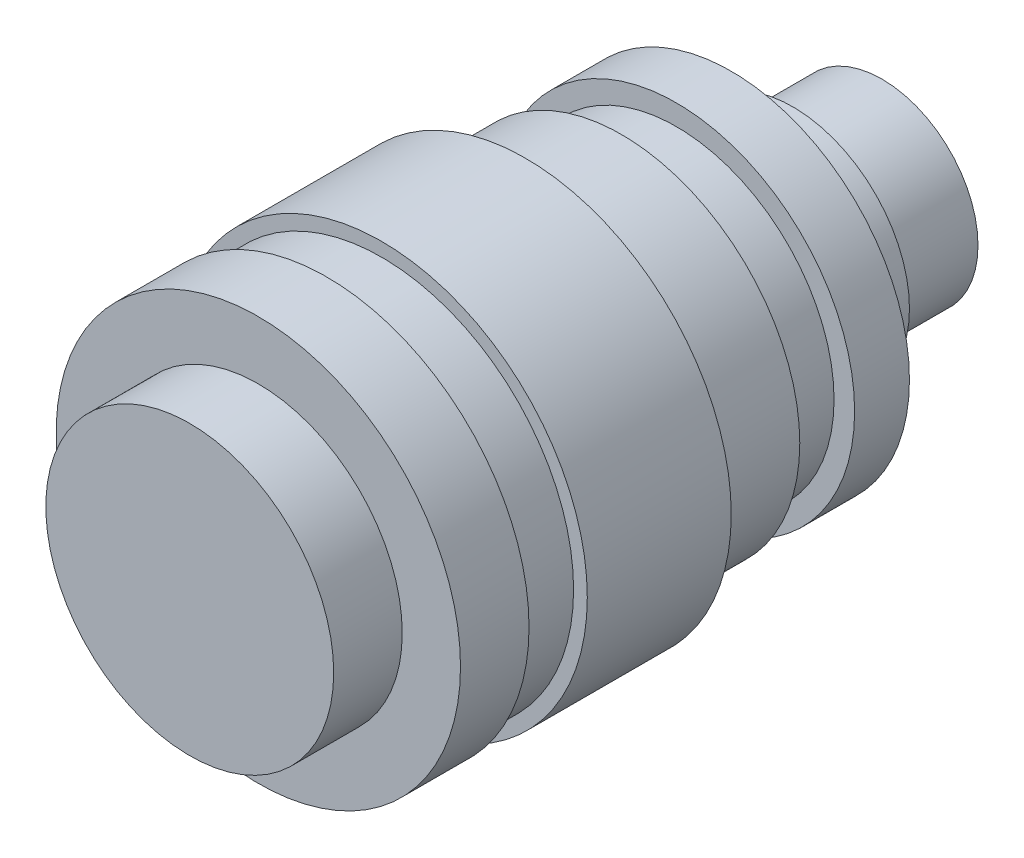
ISO-10303-21;
HEADER;
FILE_DESCRIPTION(('STEP AP214'),'2;1');
FILE_NAME('part.step','',(''),(''),'','','');
FILE_SCHEMA(('AUTOMOTIVE_DESIGN { 1 0 10303 214 1 1 1 1 }'));
ENDSEC;
DATA;
#1=APPLICATION_CONTEXT('core data for automotive mechanical design processes');
#2=APPLICATION_PROTOCOL_DEFINITION('international standard','automotive_design',2000,#1);
#3=PRODUCT_CONTEXT('',#1,'mechanical');
#4=PRODUCT('Part','Part','',(#3));
#5=PRODUCT_RELATED_PRODUCT_CATEGORY('part','',(#4));
#6=PRODUCT_DEFINITION_FORMATION('','',#4);
#7=PRODUCT_DEFINITION_CONTEXT('part definition',#1,'design');
#8=PRODUCT_DEFINITION('design','',#6,#7);
#9=PRODUCT_DEFINITION_SHAPE('','',#8);
#10=(LENGTH_UNIT() NAMED_UNIT(*) SI_UNIT(.MILLI.,.METRE.));
#11=(NAMED_UNIT(*) PLANE_ANGLE_UNIT() SI_UNIT($,.RADIAN.));
#12=(NAMED_UNIT(*) SI_UNIT($,.STERADIAN.) SOLID_ANGLE_UNIT());
#13=UNCERTAINTY_MEASURE_WITH_UNIT(LENGTH_MEASURE(1.E-05),#10,'distance_accuracy_value','');
#14=(GEOMETRIC_REPRESENTATION_CONTEXT(3) GLOBAL_UNCERTAINTY_ASSIGNED_CONTEXT((#13)) GLOBAL_UNIT_ASSIGNED_CONTEXT((#10,
#11,#12)) REPRESENTATION_CONTEXT('',''));
#15=CARTESIAN_POINT('',(0.,0.,0.));
#16=DIRECTION('',(0.,0.,1.));
#17=DIRECTION('',(1.,0.,0.));
#18=AXIS2_PLACEMENT_3D('',#15,#16,#17);
#19=CARTESIAN_POINT('',(0.,0.,5.));
#20=DIRECTION('',(0.,0.,1.));
#21=DIRECTION('',(1.,0.,0.));
#22=AXIS2_PLACEMENT_3D('',#19,#20,#21);
#23=PLANE('',#22);
#24=CARTESIAN_POINT('',(0.,0.,5.));
#25=DIRECTION('',(0.,0.,1.));
#26=DIRECTION('',(1.,0.,0.));
#27=AXIS2_PLACEMENT_3D('',#24,#25,#26);
#28=CIRCLE('',#27,10.5);
#29=CARTESIAN_POINT('',(10.5,0.,5.));
#30=VERTEX_POINT('',#29);
#31=EDGE_CURVE('E90',#30,#30,#28,.T.);
#32=ORIENTED_EDGE('',*,*,#31,.T.);
#33=EDGE_LOOP('',(#32));
#34=FACE_BOUND('',#33,.T.);
#35=ADVANCED_FACE('F32',(#34),#23,.T.);
#36=CARTESIAN_POINT('',(0.,0.,-45.4999999999999));
#37=DIRECTION('',(0.,0.,1.));
#38=DIRECTION('',(1.,0.,0.));
#39=AXIS2_PLACEMENT_3D('',#36,#37,#38);
#40=PLANE('',#39);
#41=CARTESIAN_POINT('',(0.,0.,-45.4999999999999));
#42=DIRECTION('',(0.,0.,1.));
#43=DIRECTION('',(1.,0.,0.));
#44=AXIS2_PLACEMENT_3D('',#41,#42,#43);
#45=CIRCLE('',#44,7.);
#46=CARTESIAN_POINT('',(7.,0.,-45.4999999999999));
#47=VERTEX_POINT('',#46);
#48=EDGE_CURVE('E10',#47,#47,#45,.T.);
#49=ORIENTED_EDGE('',*,*,#48,.F.);
#50=EDGE_LOOP('',(#49));
#51=FACE_BOUND('',#50,.T.);
#52=ADVANCED_FACE('F113',(#51),#40,.F.);
#53=CARTESIAN_POINT('',(0.,0.,-9.));
#54=DIRECTION('',(0.,0.,1.));
#55=DIRECTION('',(1.,0.,0.));
#56=AXIS2_PLACEMENT_3D('',#53,#54,#55);
#57=CYLINDRICAL_SURFACE('',#56,7.);
#58=ORIENTED_EDGE('',*,*,#48,.T.);
#59=EDGE_LOOP('',(#58));
#60=FACE_BOUND('',#59,.T.);
#61=CARTESIAN_POINT('',(0.,0.,-39.));
#62=DIRECTION('',(0.,0.,1.));
#63=DIRECTION('',(1.,0.,0.));
#64=AXIS2_PLACEMENT_3D('',#61,#62,#63);
#65=CIRCLE('',#64,7.);
#66=CARTESIAN_POINT('',(7.,0.,-39.));
#67=VERTEX_POINT('',#66);
#68=EDGE_CURVE('E38',#67,#67,#65,.T.);
#69=ORIENTED_EDGE('',*,*,#68,.F.);
#70=EDGE_LOOP('',(#69));
#71=FACE_BOUND('',#70,.T.);
#72=ADVANCED_FACE('F117',(#60,#71),#57,.T.);
#73=CARTESIAN_POINT('',(0.,-4.45721890768628E-13,-39.));
#74=DIRECTION('',(0.,0.,1.));
#75=DIRECTION('',(1.,0.,0.));
#76=AXIS2_PLACEMENT_3D('',#73,#74,#75);
#77=PLANE('',#76);
#78=CARTESIAN_POINT('',(0.,0.,-39.));
#79=DIRECTION('',(0.,0.,1.));
#80=DIRECTION('',(1.,0.,0.));
#81=AXIS2_PLACEMENT_3D('',#78,#79,#80);
#82=CIRCLE('',#81,8.5);
#83=CARTESIAN_POINT('',(8.5,0.,-39.));
#84=VERTEX_POINT('',#83);
#85=EDGE_CURVE('E42',#84,#84,#82,.T.);
#86=ORIENTED_EDGE('',*,*,#85,.F.);
#87=EDGE_LOOP('',(#86));
#88=FACE_BOUND('',#87,.T.);
#89=ORIENTED_EDGE('',*,*,#68,.T.);
#90=EDGE_LOOP('',(#89));
#91=FACE_BOUND('',#90,.T.);
#92=ADVANCED_FACE('F122',(#88,#91),#77,.F.);
#93=CARTESIAN_POINT('',(0.,0.,-9.));
#94=DIRECTION('',(0.,0.,1.));
#95=DIRECTION('',(1.,0.,0.));
#96=AXIS2_PLACEMENT_3D('',#93,#94,#95);
#97=CYLINDRICAL_SURFACE('',#96,8.5);
#98=ORIENTED_EDGE('',*,*,#85,.T.);
#99=EDGE_LOOP('',(#98));
#100=FACE_BOUND('',#99,.T.);
#101=CARTESIAN_POINT('',(0.,0.,-34.4999999999999));
#102=DIRECTION('',(0.,0.,1.));
#103=DIRECTION('',(1.,0.,0.));
#104=AXIS2_PLACEMENT_3D('',#101,#102,#103);
#105=CIRCLE('',#104,8.5);
#106=CARTESIAN_POINT('',(8.5,0.,-34.4999999999999));
#107=VERTEX_POINT('',#106);
#108=EDGE_CURVE('E46',#107,#107,#105,.T.);
#109=ORIENTED_EDGE('',*,*,#108,.F.);
#110=EDGE_LOOP('',(#109));
#111=FACE_BOUND('',#110,.T.);
#112=ADVANCED_FACE('F127',(#100,#111),#97,.T.);
#113=CARTESIAN_POINT('',(0.,2.5780659658363E-13,-34.4999999999999));
#114=DIRECTION('',(0.,0.,1.));
#115=DIRECTION('',(1.,0.,0.));
#116=AXIS2_PLACEMENT_3D('',#113,#114,#115);
#117=PLANE('',#116);
#118=CARTESIAN_POINT('',(0.,0.,-34.4999999999999));
#119=DIRECTION('',(0.,0.,1.));
#120=DIRECTION('',(1.,0.,0.));
#121=AXIS2_PLACEMENT_3D('',#118,#119,#120);
#122=CIRCLE('',#121,13.);
#123=CARTESIAN_POINT('',(13.,0.,-34.4999999999999));
#124=VERTEX_POINT('',#123);
#125=EDGE_CURVE('E51',#124,#124,#122,.T.);
#126=ORIENTED_EDGE('',*,*,#125,.F.);
#127=EDGE_LOOP('',(#126));
#128=FACE_BOUND('',#127,.T.);
#129=ORIENTED_EDGE('',*,*,#108,.T.);
#130=EDGE_LOOP('',(#129));
#131=FACE_BOUND('',#130,.T.);
#132=ADVANCED_FACE('F131',(#128,#131),#117,.F.);
#133=CARTESIAN_POINT('',(0.,0.,-9.));
#134=DIRECTION('',(0.,0.,1.));
#135=DIRECTION('',(1.,0.,0.));
#136=AXIS2_PLACEMENT_3D('',#133,#134,#135);
#137=CYLINDRICAL_SURFACE('',#136,13.);
#138=ORIENTED_EDGE('',*,*,#125,.T.);
#139=EDGE_LOOP('',(#138));
#140=FACE_BOUND('',#139,.T.);
#141=CARTESIAN_POINT('',(0.,0.,-30.4999999999999));
#142=DIRECTION('',(0.,0.,1.));
#143=DIRECTION('',(1.,0.,0.));
#144=AXIS2_PLACEMENT_3D('',#141,#142,#143);
#145=CIRCLE('',#144,13.);
#146=CARTESIAN_POINT('',(13.,0.,-30.4999999999999));
#147=VERTEX_POINT('',#146);
#148=EDGE_CURVE('E54',#147,#147,#145,.T.);
#149=ORIENTED_EDGE('',*,*,#148,.F.);
#150=EDGE_LOOP('',(#149));
#151=FACE_BOUND('',#150,.T.);
#152=ADVANCED_FACE('F135',(#140,#151),#137,.T.);
#153=CARTESIAN_POINT('',(0.,0.,-30.4999999999999));
#154=DIRECTION('',(0.,0.,1.));
#155=DIRECTION('',(1.,0.,0.));
#156=AXIS2_PLACEMENT_3D('',#153,#154,#155);
#157=PLANE('',#156);
#158=ORIENTED_EDGE('',*,*,#148,.T.);
#159=EDGE_LOOP('',(#158));
#160=FACE_BOUND('',#159,.T.);
#161=CARTESIAN_POINT('',(0.,0.,-30.5));
#162=DIRECTION('',(0.,0.,1.));
#163=DIRECTION('',(1.,0.,0.));
#164=AXIS2_PLACEMENT_3D('',#161,#162,#163);
#165=CIRCLE('',#164,11.5);
#166=CARTESIAN_POINT('',(11.5,0.,-30.5));
#167=VERTEX_POINT('',#166);
#168=EDGE_CURVE('E57',#167,#167,#165,.T.);
#169=ORIENTED_EDGE('',*,*,#168,.F.);
#170=EDGE_LOOP('',(#169));
#171=FACE_BOUND('',#170,.T.);
#172=ADVANCED_FACE('F139',(#160,#171),#157,.T.);
#173=CARTESIAN_POINT('',(0.,0.,-9.));
#174=DIRECTION('',(0.,0.,1.));
#175=DIRECTION('',(1.,0.,0.));
#176=AXIS2_PLACEMENT_3D('',#173,#174,#175);
#177=CYLINDRICAL_SURFACE('',#176,11.5);
#178=ORIENTED_EDGE('',*,*,#168,.T.);
#179=EDGE_LOOP('',(#178));
#180=FACE_BOUND('',#179,.T.);
#181=CARTESIAN_POINT('',(0.,0.,-26.5));
#182=DIRECTION('',(0.,0.,1.));
#183=DIRECTION('',(1.,0.,0.));
#184=AXIS2_PLACEMENT_3D('',#181,#182,#183);
#185=CIRCLE('',#184,11.5);
#186=CARTESIAN_POINT('',(11.5,0.,-26.5));
#187=VERTEX_POINT('',#186);
#188=EDGE_CURVE('E60',#187,#187,#185,.T.);
#189=ORIENTED_EDGE('',*,*,#188,.F.);
#190=EDGE_LOOP('',(#189));
#191=FACE_BOUND('',#190,.T.);
#192=ADVANCED_FACE('F143',(#180,#191),#177,.T.);
#193=CARTESIAN_POINT('',(0.,0.,-26.5));
#194=DIRECTION('',(0.,0.,1.));
#195=DIRECTION('',(1.,0.,0.));
#196=AXIS2_PLACEMENT_3D('',#193,#194,#195);
#197=PLANE('',#196);
#198=CARTESIAN_POINT('',(0.,0.,-26.5));
#199=DIRECTION('',(0.,0.,1.));
#200=DIRECTION('',(1.,0.,0.));
#201=AXIS2_PLACEMENT_3D('',#198,#199,#200);
#202=CIRCLE('',#201,13.);
#203=CARTESIAN_POINT('',(13.,0.,-26.5));
#204=VERTEX_POINT('',#203);
#205=EDGE_CURVE('E63',#204,#204,#202,.T.);
#206=ORIENTED_EDGE('',*,*,#205,.F.);
#207=EDGE_LOOP('',(#206));
#208=FACE_BOUND('',#207,.T.);
#209=ORIENTED_EDGE('',*,*,#188,.T.);
#210=EDGE_LOOP('',(#209));
#211=FACE_BOUND('',#210,.T.);
#212=ADVANCED_FACE('F147',(#208,#211),#197,.F.);
#213=CARTESIAN_POINT('',(0.,0.,-9.));
#214=DIRECTION('',(0.,0.,1.));
#215=DIRECTION('',(1.,0.,0.));
#216=AXIS2_PLACEMENT_3D('',#213,#214,#215);
#217=CYLINDRICAL_SURFACE('',#216,13.);
#218=ORIENTED_EDGE('',*,*,#205,.T.);
#219=EDGE_LOOP('',(#218));
#220=FACE_BOUND('',#219,.T.);
#221=CARTESIAN_POINT('',(0.,0.,-19.5));
#222=DIRECTION('',(0.,0.,1.));
#223=DIRECTION('',(1.,0.,0.));
#224=AXIS2_PLACEMENT_3D('',#221,#222,#223);
#225=CIRCLE('',#224,13.);
#226=CARTESIAN_POINT('',(13.,0.,-19.5));
#227=VERTEX_POINT('',#226);
#228=EDGE_CURVE('E66',#227,#227,#225,.T.);
#229=ORIENTED_EDGE('',*,*,#228,.F.);
#230=EDGE_LOOP('',(#229));
#231=FACE_BOUND('',#230,.T.);
#232=ADVANCED_FACE('F151',(#220,#231),#217,.T.);
#233=CARTESIAN_POINT('',(0.,0.,-19.5));
#234=DIRECTION('',(0.,0.,1.));
#235=DIRECTION('',(1.,0.,0.));
#236=AXIS2_PLACEMENT_3D('',#233,#234,#235);
#237=PLANE('',#236);
#238=CARTESIAN_POINT('',(0.,0.,-19.5));
#239=DIRECTION('',(0.,0.,1.));
#240=DIRECTION('',(1.,0.,0.));
#241=AXIS2_PLACEMENT_3D('',#238,#239,#240);
#242=CIRCLE('',#241,15.);
#243=CARTESIAN_POINT('',(15.,0.,-19.5));
#244=VERTEX_POINT('',#243);
#245=EDGE_CURVE('E69',#244,#244,#242,.T.);
#246=ORIENTED_EDGE('',*,*,#245,.F.);
#247=EDGE_LOOP('',(#246));
#248=FACE_BOUND('',#247,.T.);
#249=ORIENTED_EDGE('',*,*,#228,.T.);
#250=EDGE_LOOP('',(#249));
#251=FACE_BOUND('',#250,.T.);
#252=ADVANCED_FACE('F155',(#248,#251),#237,.F.);
#253=CARTESIAN_POINT('',(0.,0.,-9.));
#254=DIRECTION('',(0.,0.,1.));
#255=DIRECTION('',(1.,0.,0.));
#256=AXIS2_PLACEMENT_3D('',#253,#254,#255);
#257=CYLINDRICAL_SURFACE('',#256,15.);
#258=ORIENTED_EDGE('',*,*,#245,.T.);
#259=EDGE_LOOP('',(#258));
#260=FACE_BOUND('',#259,.T.);
#261=CARTESIAN_POINT('',(0.,0.,-9.));
#262=DIRECTION('',(0.,0.,1.));
#263=DIRECTION('',(1.,0.,0.));
#264=AXIS2_PLACEMENT_3D('',#261,#262,#263);
#265=CIRCLE('',#264,15.);
#266=CARTESIAN_POINT('',(15.,0.,-9.));
#267=VERTEX_POINT('',#266);
#268=EDGE_CURVE('E72',#267,#267,#265,.T.);
#269=ORIENTED_EDGE('',*,*,#268,.F.);
#270=EDGE_LOOP('',(#269));
#271=FACE_BOUND('',#270,.T.);
#272=ADVANCED_FACE('F159',(#260,#271),#257,.T.);
#273=CARTESIAN_POINT('',(0.,0.,-9.));
#274=DIRECTION('',(0.,0.,1.));
#275=DIRECTION('',(1.,0.,0.));
#276=AXIS2_PLACEMENT_3D('',#273,#274,#275);
#277=PLANE('',#276);
#278=ORIENTED_EDGE('',*,*,#268,.T.);
#279=EDGE_LOOP('',(#278));
#280=FACE_BOUND('',#279,.T.);
#281=CARTESIAN_POINT('',(0.,0.,-9.));
#282=DIRECTION('',(0.,0.,1.));
#283=DIRECTION('',(1.,0.,0.));
#284=AXIS2_PLACEMENT_3D('',#281,#282,#283);
#285=CIRCLE('',#284,14.);
#286=CARTESIAN_POINT('',(14.,0.,-9.));
#287=VERTEX_POINT('',#286);
#288=EDGE_CURVE('E75',#287,#287,#285,.T.);
#289=ORIENTED_EDGE('',*,*,#288,.F.);
#290=EDGE_LOOP('',(#289));
#291=FACE_BOUND('',#290,.T.);
#292=ADVANCED_FACE('F163',(#280,#291),#277,.T.);
#293=CARTESIAN_POINT('',(0.,0.,-9.));
#294=DIRECTION('',(0.,0.,1.));
#295=DIRECTION('',(1.,0.,0.));
#296=AXIS2_PLACEMENT_3D('',#293,#294,#295);
#297=CYLINDRICAL_SURFACE('',#296,14.);
#298=ORIENTED_EDGE('',*,*,#288,.T.);
#299=EDGE_LOOP('',(#298));
#300=FACE_BOUND('',#299,.T.);
#301=CARTESIAN_POINT('',(0.,0.,-5.));
#302=DIRECTION('',(0.,0.,1.));
#303=DIRECTION('',(1.,0.,0.));
#304=AXIS2_PLACEMENT_3D('',#301,#302,#303);
#305=CIRCLE('',#304,14.);
#306=CARTESIAN_POINT('',(14.,0.,-5.));
#307=VERTEX_POINT('',#306);
#308=EDGE_CURVE('E78',#307,#307,#305,.T.);
#309=ORIENTED_EDGE('',*,*,#308,.F.);
#310=EDGE_LOOP('',(#309));
#311=FACE_BOUND('',#310,.T.);
#312=ADVANCED_FACE('F167',(#300,#311),#297,.T.);
#313=CARTESIAN_POINT('',(0.,0.,-5.));
#314=DIRECTION('',(0.,0.,1.));
#315=DIRECTION('',(1.,0.,0.));
#316=AXIS2_PLACEMENT_3D('',#313,#314,#315);
#317=PLANE('',#316);
#318=CARTESIAN_POINT('',(0.,0.,-5.));
#319=DIRECTION('',(0.,0.,1.));
#320=DIRECTION('',(1.,0.,0.));
#321=AXIS2_PLACEMENT_3D('',#318,#319,#320);
#322=CIRCLE('',#321,14.75);
#323=CARTESIAN_POINT('',(14.75,0.,-5.));
#324=VERTEX_POINT('',#323);
#325=EDGE_CURVE('E81',#324,#324,#322,.T.);
#326=ORIENTED_EDGE('',*,*,#325,.F.);
#327=EDGE_LOOP('',(#326));
#328=FACE_BOUND('',#327,.T.);
#329=ORIENTED_EDGE('',*,*,#308,.T.);
#330=EDGE_LOOP('',(#329));
#331=FACE_BOUND('',#330,.T.);
#332=ADVANCED_FACE('F109',(#328,#331),#317,.F.);
#333=CARTESIAN_POINT('',(0.,0.,-9.));
#334=DIRECTION('',(0.,0.,1.));
#335=DIRECTION('',(1.,0.,0.));
#336=AXIS2_PLACEMENT_3D('',#333,#334,#335);
#337=CYLINDRICAL_SURFACE('',#336,14.75);
#338=ORIENTED_EDGE('',*,*,#325,.T.);
#339=EDGE_LOOP('',(#338));
#340=FACE_BOUND('',#339,.T.);
#341=CARTESIAN_POINT('',(0.,0.,0.));
#342=DIRECTION('',(0.,0.,1.));
#343=DIRECTION('',(1.,0.,0.));
#344=AXIS2_PLACEMENT_3D('',#341,#342,#343);
#345=CIRCLE('',#344,14.75);
#346=CARTESIAN_POINT('',(14.75,0.,0.));
#347=VERTEX_POINT('',#346);
#348=EDGE_CURVE('E84',#347,#347,#345,.T.);
#349=ORIENTED_EDGE('',*,*,#348,.F.);
#350=EDGE_LOOP('',(#349));
#351=FACE_BOUND('',#350,.T.);
#352=ADVANCED_FACE('F103',(#340,#351),#337,.T.);
#353=CARTESIAN_POINT('',(0.,0.,0.));
#354=DIRECTION('',(0.,0.,1.));
#355=DIRECTION('',(1.,0.,0.));
#356=AXIS2_PLACEMENT_3D('',#353,#354,#355);
#357=PLANE('',#356);
#358=ORIENTED_EDGE('',*,*,#348,.T.);
#359=EDGE_LOOP('',(#358));
#360=FACE_BOUND('',#359,.T.);
#361=CARTESIAN_POINT('',(0.,0.,0.));
#362=DIRECTION('',(0.,0.,1.));
#363=DIRECTION('',(1.,0.,0.));
#364=AXIS2_PLACEMENT_3D('',#361,#362,#363);
#365=CIRCLE('',#364,10.5);
#366=CARTESIAN_POINT('',(10.5,0.,0.));
#367=VERTEX_POINT('',#366);
#368=EDGE_CURVE('E87',#367,#367,#365,.T.);
#369=ORIENTED_EDGE('',*,*,#368,.F.);
#370=EDGE_LOOP('',(#369));
#371=FACE_BOUND('',#370,.T.);
#372=ADVANCED_FACE('F98',(#360,#371),#357,.T.);
#373=CARTESIAN_POINT('',(0.,0.,-9.));
#374=DIRECTION('',(0.,0.,1.));
#375=DIRECTION('',(1.,0.,0.));
#376=AXIS2_PLACEMENT_3D('',#373,#374,#375);
#377=CYLINDRICAL_SURFACE('',#376,10.5);
#378=ORIENTED_EDGE('',*,*,#31,.F.);
#379=EDGE_LOOP('',(#378));
#380=FACE_BOUND('',#379,.T.);
#381=ORIENTED_EDGE('',*,*,#368,.T.);
#382=EDGE_LOOP('',(#381));
#383=FACE_BOUND('',#382,.T.);
#384=ADVANCED_FACE('F95',(#380,#383),#377,.T.);
#385=CLOSED_SHELL('',(#35,#52,#72,#92,#112,#132,#152,#172,#192,#212,#232,#252,#272,#292,#312,
#332,#352,#372,#384));
#386=MANIFOLD_SOLID_BREP('B2',#385);
#387=ADVANCED_BREP_SHAPE_REPRESENTATION('',(#18,#386),#14);
#388=SHAPE_DEFINITION_REPRESENTATION(#9,#387);
ENDSEC;
END-ISO-10303-21;
